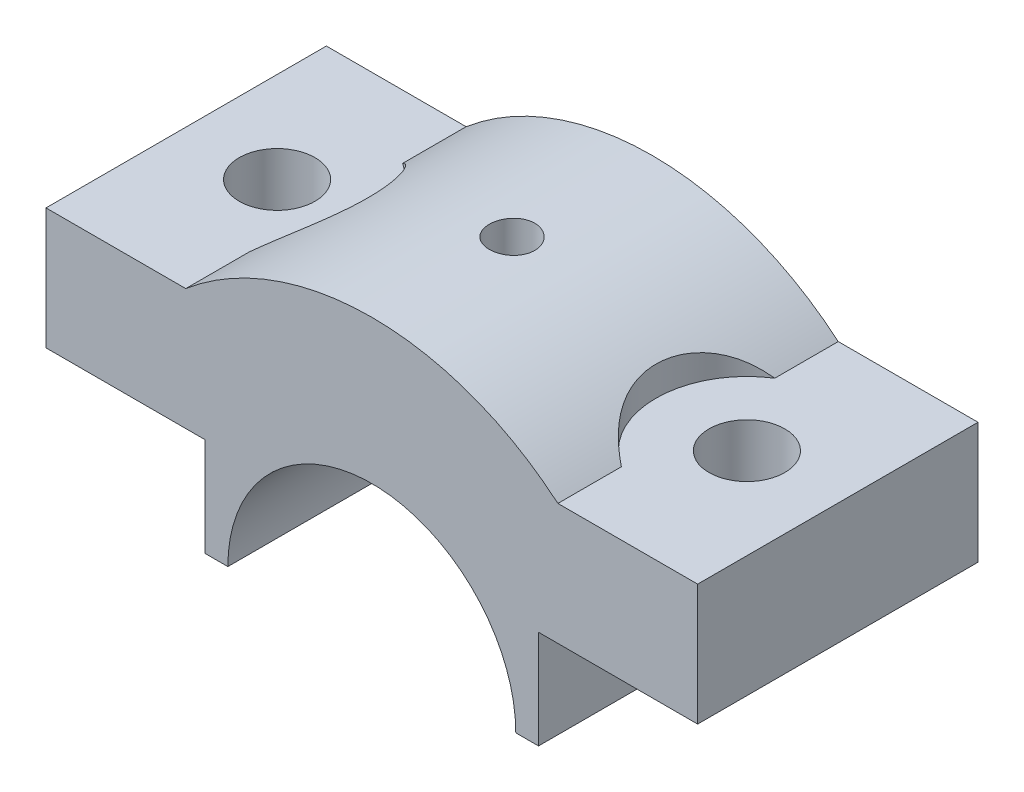
ISO-10303-21;
HEADER;
FILE_DESCRIPTION(('STEP AP214'),'2;1');
FILE_NAME('part.step','',(''),(''),'','','');
FILE_SCHEMA(('AUTOMOTIVE_DESIGN { 1 0 10303 214 1 1 1 1 }'));
ENDSEC;
DATA;
#1=APPLICATION_CONTEXT('core data for automotive mechanical design processes');
#2=APPLICATION_PROTOCOL_DEFINITION('international standard','automotive_design',2000,#1);
#3=PRODUCT_CONTEXT('',#1,'mechanical');
#4=PRODUCT('Part','Part','',(#3));
#5=PRODUCT_RELATED_PRODUCT_CATEGORY('part','',(#4));
#6=PRODUCT_DEFINITION_FORMATION('','',#4);
#7=PRODUCT_DEFINITION_CONTEXT('part definition',#1,'design');
#8=PRODUCT_DEFINITION('design','',#6,#7);
#9=PRODUCT_DEFINITION_SHAPE('','',#8);
#10=(LENGTH_UNIT() NAMED_UNIT(*) SI_UNIT(.MILLI.,.METRE.));
#11=(NAMED_UNIT(*) PLANE_ANGLE_UNIT() SI_UNIT($,.RADIAN.));
#12=(NAMED_UNIT(*) SI_UNIT($,.STERADIAN.) SOLID_ANGLE_UNIT());
#13=UNCERTAINTY_MEASURE_WITH_UNIT(LENGTH_MEASURE(1.E-05),#10,'distance_accuracy_value','');
#14=(GEOMETRIC_REPRESENTATION_CONTEXT(3) GLOBAL_UNCERTAINTY_ASSIGNED_CONTEXT((#13)) GLOBAL_UNIT_ASSIGNED_CONTEXT((#10,
#11,#12)) REPRESENTATION_CONTEXT('',''));
#15=CARTESIAN_POINT('',(0.,0.,0.));
#16=DIRECTION('',(0.,0.,1.));
#17=DIRECTION('',(1.,0.,0.));
#18=AXIS2_PLACEMENT_3D('',#15,#16,#17);
#19=CARTESIAN_POINT('',(0.,0.,37.));
#20=DIRECTION('',(0.,0.,-1.));
#21=DIRECTION('',(-1.,0.,0.));
#22=AXIS2_PLACEMENT_3D('',#19,#20,#21);
#23=CYLINDRICAL_SURFACE('',#22,38.);
#24=CARTESIAN_POINT('',(24.5560583156173,29.,8.37697596721832));
#25=CARTESIAN_POINT('',(24.3174877485478,29.2020601308055,8.52880532678772));
#26=CARTESIAN_POINT('',(24.0803614609093,29.3977464472566,8.69163802336802));
#27=CARTESIAN_POINT('',(23.6115222338329,29.7755940747945,9.03979151666468));
#28=CARTESIAN_POINT('',(23.3798137585638,29.9577444842871,9.22513012953136));
#29=CARTESIAN_POINT('',(22.9236672054079,30.3082297817881,9.61944940490282));
#30=CARTESIAN_POINT('',(22.6992678834907,30.4764965902736,9.82853585241824));
#31=CARTESIAN_POINT('',(22.2619530588752,30.7973853777589,10.2693930241928));
#32=CARTESIAN_POINT('',(22.0490345989108,30.9500113947584,10.5011578631887));
#33=CARTESIAN_POINT('',(21.6366389073685,31.2397139014292,10.9880250162818));
#34=CARTESIAN_POINT('',(21.4372383074072,31.3767043342369,11.2432437261789));
#35=CARTESIAN_POINT('',(21.0562467019345,31.633641893745,11.7747724046578));
#36=CARTESIAN_POINT('',(20.8746574661727,31.7535873273726,12.0510844642489));
#37=CARTESIAN_POINT('',(20.5327564022872,31.9757314891997,12.6223021685555));
#38=CARTESIAN_POINT('',(20.3723929409772,32.0779734764171,12.9171600193247));
#39=CARTESIAN_POINT('',(20.0751813729038,32.2648095853997,13.5238179116656));
#40=CARTESIAN_POINT('',(19.938330146147,32.349406048985,13.8356156981269));
#41=CARTESIAN_POINT('',(19.7031571958431,32.4931162623317,14.4409607265898));
#42=CARTESIAN_POINT('',(19.6023304372824,32.5539481974974,14.7331305874555));
#43=CARTESIAN_POINT('',(19.4229982355688,32.661262620038,15.3268061987076));
#44=CARTESIAN_POINT('',(19.3444914281107,32.707745984483,15.6283113772236));
#45=CARTESIAN_POINT('',(19.2108996671468,32.7863897663112,16.2384329952647));
#46=CARTESIAN_POINT('',(19.1558244632389,32.8185442218776,16.5470523387123));
#47=CARTESIAN_POINT('',(19.0699386598041,32.8685247770595,17.1687946625474));
#48=CARTESIAN_POINT('',(19.0391272676089,32.8863513447496,17.4819174954713));
#49=CARTESIAN_POINT('',(19.0033366089455,32.9070445700549,18.0909071788436));
#50=CARTESIAN_POINT('',(18.9968952852205,32.9107579979133,18.3866606151427));
#51=CARTESIAN_POINT('',(19.0058709098437,32.9055755487408,18.9777151692396));
#52=CARTESIAN_POINT('',(19.0212867536059,32.8966803089086,19.2730163091401));
#53=CARTESIAN_POINT('',(19.0737722856435,32.8662764129345,19.8609465930672));
#54=CARTESIAN_POINT('',(19.1108359102242,32.8447712889028,20.1535764620329));
#55=CARTESIAN_POINT('',(19.2061408416427,32.7891322412201,20.7341490720516));
#56=CARTESIAN_POINT('',(19.264382276703,32.7549982411068,21.0220917847148));
#57=CARTESIAN_POINT('',(19.4006764422116,32.6744541101646,21.5886588319729));
#58=CARTESIAN_POINT('',(19.4785435602166,32.6281588318639,21.8673442180909));
#59=CARTESIAN_POINT('',(19.6533719646105,32.5231511116921,22.4162477828628));
#60=CARTESIAN_POINT('',(19.7503330082788,32.4644388276644,22.6864660690993));
#61=CARTESIAN_POINT('',(19.9621218133717,32.3346424316118,23.2166418111918));
#62=CARTESIAN_POINT('',(20.0769448179247,32.2635616128921,23.4766019758774));
#63=CARTESIAN_POINT('',(20.323071538153,32.1090931283231,23.9847892596351));
#64=CARTESIAN_POINT('',(20.4543754358737,32.0257053265307,24.2330162490626));
#65=CARTESIAN_POINT('',(20.7357486540301,31.8442696037435,24.723117088294));
#66=CARTESIAN_POINT('',(20.8862381186548,31.7458786272729,24.9646225824166));
#67=CARTESIAN_POINT('',(21.201110037337,31.5364658710071,25.4326270062543));
#68=CARTESIAN_POINT('',(21.3654931809921,31.4254434641697,25.6591251901014));
#69=CARTESIAN_POINT('',(21.7063737161355,31.1909623888811,26.0964085949474));
#70=CARTESIAN_POINT('',(21.8828828178434,31.0674916435289,26.3071782050159));
#71=CARTESIAN_POINT('',(22.2458177672454,30.8086571106979,26.7120807419208));
#72=CARTESIAN_POINT('',(22.4322425263686,30.6732946276711,26.906215488898));
#73=CARTESIAN_POINT('',(22.9298954071164,30.3045469407131,27.3914120034024));
#74=CARTESIAN_POINT('',(23.2476114084472,30.0619152228811,27.6689892609468));
#75=CARTESIAN_POINT('',(23.7330937930094,29.6779862071021,28.0516756753478));
#76=CARTESIAN_POINT('',(23.896151828646,29.5468936289064,28.1734651547196));
#77=CARTESIAN_POINT('',(24.2245693700738,29.2782386813056,28.4062595620869));
#78=CARTESIAN_POINT('',(24.3899285039598,29.140677349028,28.5172662101907));
#79=CARTESIAN_POINT('',(24.5560583156173,29.,28.6230240327817));
#80=B_SPLINE_CURVE_WITH_KNOTS('',3,(#24,#25,#26,#27,#28,#29,#30,#31,#32,#33,#34,#35,#36,#37,#38,
#39,#40,#41,#42,#43,#44,#45,#46,#47,#48,#49,#50,#51,#52,#53,#54,#55,#56,#57,#58,#59,#60,#61,#62,
#63,#64,#65,#66,#67,#68,#69,#70,#71,#72,#73,#74,#75,#76,#77,#78,#79),.UNSPECIFIED.,.F.,.F.,(4,2,
2,2,2,2,2,2,2,2,2,2,2,2,2,2,2,2,2,2,2,2,2,2,2,2,2,4),(0.,1.04260461579408,2.08604002646036,
3.13432060286791,4.18232985812433,5.23585430274668,6.28948332048406,7.34050026578761,
8.3913776368236,9.33518162511065,10.2789279110469,11.2230664949041,12.1671742336547,
13.0536509025234,13.9400827735082,14.8262664677282,15.7124555274994,16.590558754706,
17.4686508202461,18.346509437567,19.2243777524392,20.1266463918459,21.028959840704,
21.9321572606495,22.8352557287013,24.2916394519587,25.0176312708732,25.7435070866397),.UNSPECIFIED.);
#81=CARTESIAN_POINT('',(24.5560583156174,29.,8.37697596721831));
#82=VERTEX_POINT('',#81);
#83=CARTESIAN_POINT('',(24.5560583156174,29.,28.6230240327817));
#84=VERTEX_POINT('',#83);
#85=EDGE_CURVE('E144',#82,#84,#80,.T.);
#86=ORIENTED_EDGE('',*,*,#85,.F.);
#87=DIRECTION('',(0.,0.,-1.));
#88=VECTOR('',#87,1.);
#89=CARTESIAN_POINT('',(24.5560583156174,29.,37.));
#90=LINE('',#89,#88);
#91=CARTESIAN_POINT('',(24.5560583156174,29.,0.));
#92=VERTEX_POINT('',#91);
#93=EDGE_CURVE('E151',#82,#92,#90,.T.);
#94=ORIENTED_EDGE('',*,*,#93,.T.);
#95=CARTESIAN_POINT('',(0.,0.,0.));
#96=DIRECTION('',(0.,0.,1.));
#97=DIRECTION('',(1.,0.,0.));
#98=AXIS2_PLACEMENT_3D('',#95,#96,#97);
#99=CIRCLE('',#98,38.);
#100=CARTESIAN_POINT('',(-24.5560583156174,29.,0.));
#101=VERTEX_POINT('',#100);
#102=EDGE_CURVE('E268',#92,#101,#99,.T.);
#103=ORIENTED_EDGE('',*,*,#102,.T.);
#104=DIRECTION('',(0.,0.,-1.));
#105=VECTOR('',#104,1.);
#106=CARTESIAN_POINT('',(-24.5560583156174,29.,37.));
#107=LINE('',#106,#105);
#108=CARTESIAN_POINT('',(-24.5560583156174,29.,8.3769759672183));
#109=VERTEX_POINT('',#108);
#110=EDGE_CURVE('E164',#109,#101,#107,.T.);
#111=ORIENTED_EDGE('',*,*,#110,.F.);
#112=CARTESIAN_POINT('',(-24.5560583156173,29.,28.6230240327817));
#113=CARTESIAN_POINT('',(-24.3174877485478,29.2020601308055,28.4711946732123));
#114=CARTESIAN_POINT('',(-24.0803614609093,29.3977464472566,28.308361976632));
#115=CARTESIAN_POINT('',(-23.6115222338329,29.7755940747945,27.9602084833353));
#116=CARTESIAN_POINT('',(-23.3798137585639,29.9577444842871,27.7748698704687));
#117=CARTESIAN_POINT('',(-22.9236672054079,30.3082297817881,27.3805505950972));
#118=CARTESIAN_POINT('',(-22.6992678834907,30.4764965902736,27.1714641475818));
#119=CARTESIAN_POINT('',(-22.2619530588752,30.7973853777589,26.7306069758073));
#120=CARTESIAN_POINT('',(-22.0490345989108,30.9500113947584,26.4988421368114));
#121=CARTESIAN_POINT('',(-21.6366389073685,31.2397139014292,26.0119749837182));
#122=CARTESIAN_POINT('',(-21.4372383074072,31.3767043342369,25.7567562738212));
#123=CARTESIAN_POINT('',(-21.0562467019345,31.633641893745,25.2252275953423));
#124=CARTESIAN_POINT('',(-20.8746574661727,31.7535873273726,24.9489155357511));
#125=CARTESIAN_POINT('',(-20.5327564022873,31.9757314891997,24.3776978314445));
#126=CARTESIAN_POINT('',(-20.3723929409772,32.0779734764171,24.0828399806753));
#127=CARTESIAN_POINT('',(-20.0751813729038,32.2648095853997,23.4761820883344));
#128=CARTESIAN_POINT('',(-19.938330146147,32.349406048985,23.1643843018731));
#129=CARTESIAN_POINT('',(-19.7031571958431,32.4931162623317,22.5590392734102));
#130=CARTESIAN_POINT('',(-19.6023304372824,32.5539481974974,22.2668694125445));
#131=CARTESIAN_POINT('',(-19.4229982355688,32.661262620038,21.6731938012924));
#132=CARTESIAN_POINT('',(-19.3444914281107,32.707745984483,21.3716886227764));
#133=CARTESIAN_POINT('',(-19.2108996671468,32.7863897663113,20.7615670047353));
#134=CARTESIAN_POINT('',(-19.1558244632389,32.8185442218776,20.4529476612877));
#135=CARTESIAN_POINT('',(-19.0699386598041,32.8685247770595,19.8312053374526));
#136=CARTESIAN_POINT('',(-19.0391272676089,32.8863513447496,19.5180825045287));
#137=CARTESIAN_POINT('',(-19.0033366089455,32.9070445700549,18.9090928211564));
#138=CARTESIAN_POINT('',(-18.9968952852205,32.9107579979134,18.6133393848573));
#139=CARTESIAN_POINT('',(-19.0058709098437,32.9055755487409,18.0222848307604));
#140=CARTESIAN_POINT('',(-19.0212867536059,32.8966803089086,17.7269836908599));
#141=CARTESIAN_POINT('',(-19.0737722856435,32.8662764129345,17.1390534069328));
#142=CARTESIAN_POINT('',(-19.1108359102242,32.8447712889028,16.8464235379671));
#143=CARTESIAN_POINT('',(-19.2061408416427,32.7891322412201,16.2658509279485));
#144=CARTESIAN_POINT('',(-19.264382276703,32.7549982411068,15.9779082152852));
#145=CARTESIAN_POINT('',(-19.4006764422116,32.6744541101646,15.4113411680271));
#146=CARTESIAN_POINT('',(-19.4785435602166,32.6281588318639,15.1326557819091));
#147=CARTESIAN_POINT('',(-19.6533719646105,32.5231511116921,14.5837522171372));
#148=CARTESIAN_POINT('',(-19.7503330082788,32.4644388276644,14.3135339309007));
#149=CARTESIAN_POINT('',(-19.9621218133717,32.3346424316118,13.7833581888082));
#150=CARTESIAN_POINT('',(-20.0769448179247,32.2635616128921,13.5233980241226));
#151=CARTESIAN_POINT('',(-20.323071538153,32.1090931283231,13.0152107403649));
#152=CARTESIAN_POINT('',(-20.4543754358737,32.0257053265308,12.7669837509374));
#153=CARTESIAN_POINT('',(-20.7357486540301,31.8442696037435,12.2768829117061));
#154=CARTESIAN_POINT('',(-20.8862381186548,31.7458786272729,12.0353774175834));
#155=CARTESIAN_POINT('',(-21.201110037337,31.5364658710071,11.5673729937457));
#156=CARTESIAN_POINT('',(-21.3654931809921,31.4254434641697,11.3408748098987));
#157=CARTESIAN_POINT('',(-21.7063737161354,31.1909623888811,10.9035914050526));
#158=CARTESIAN_POINT('',(-21.8828828178434,31.0674916435289,10.6928217949841));
#159=CARTESIAN_POINT('',(-22.2458177672454,30.8086571106979,10.2879192580792));
#160=CARTESIAN_POINT('',(-22.4322425263686,30.6732946276711,10.093784511102));
#161=CARTESIAN_POINT('',(-22.9298954071164,30.3045469407131,9.60858799659761));
#162=CARTESIAN_POINT('',(-23.2476114084472,30.0619152228811,9.33101073905317));
#163=CARTESIAN_POINT('',(-23.7330937930094,29.6779862071021,8.94832432465222));
#164=CARTESIAN_POINT('',(-23.896151828646,29.5468936289064,8.82653484528045));
#165=CARTESIAN_POINT('',(-24.2245693700738,29.2782386813056,8.59374043791307));
#166=CARTESIAN_POINT('',(-24.3899285039598,29.140677349028,8.48273378980929));
#167=CARTESIAN_POINT('',(-24.5560583156173,29.,8.37697596721831));
#168=B_SPLINE_CURVE_WITH_KNOTS('',3,(#112,#113,#114,#115,#116,#117,#118,#119,#120,#121,#122,
#123,#124,#125,#126,#127,#128,#129,#130,#131,#132,#133,#134,#135,#136,#137,#138,#139,#140,#141,
#142,#143,#144,#145,#146,#147,#148,#149,#150,#151,#152,#153,#154,#155,#156,#157,#158,#159,#160,
#161,#162,#163,#164,#165,#166,#167),.UNSPECIFIED.,.F.,.F.,(4,2,2,2,2,2,2,2,2,2,2,2,2,2,2,2,2,2,
2,2,2,2,2,2,2,2,2,4),(0.,1.04260461579408,2.08604002646036,3.13432060286791,4.18232985812432,
5.23585430274667,6.28948332048406,7.34050026578761,8.3913776368236,9.33518162511065,
10.2789279110469,11.2230664949041,12.1671742336547,13.0536509025234,13.9400827735082,
14.8262664677282,15.7124555274994,16.590558754706,17.4686508202461,18.346509437567,
19.2243777524392,20.1266463918459,21.028959840704,21.9321572606495,22.8352557287013,
24.2916394519587,25.0176312708732,25.7435070866397),.UNSPECIFIED.);
#169=CARTESIAN_POINT('',(-24.5560583156174,29.,28.6230240327817));
#170=VERTEX_POINT('',#169);
#171=EDGE_CURVE('E216',#170,#109,#168,.T.);
#172=ORIENTED_EDGE('',*,*,#171,.F.);
#173=CARTESIAN_POINT('',(-24.5560583156174,29.,37.));
#174=VERTEX_POINT('',#173);
#175=EDGE_CURVE('E161',#174,#170,#107,.T.);
#176=ORIENTED_EDGE('',*,*,#175,.F.);
#177=CARTESIAN_POINT('',(0.,0.,37.));
#178=DIRECTION('',(0.,0.,1.));
#179=DIRECTION('',(1.,0.,0.));
#180=AXIS2_PLACEMENT_3D('',#177,#178,#179);
#181=CIRCLE('',#180,38.);
#182=CARTESIAN_POINT('',(24.5560583156174,29.,37.));
#183=VERTEX_POINT('',#182);
#184=EDGE_CURVE('E243',#183,#174,#181,.T.);
#185=ORIENTED_EDGE('',*,*,#184,.F.);
#186=EDGE_CURVE('E154',#183,#84,#90,.T.);
#187=ORIENTED_EDGE('',*,*,#186,.T.);
#188=EDGE_LOOP('',(#86,#94,#103,#111,#172,#176,#185,#187));
#189=FACE_BOUND('',#188,.T.);
#190=CARTESIAN_POINT('',(0.,38.,15.5));
#191=CARTESIAN_POINT('',(-0.168230277437708,37.9999984430739,15.5000073613165));
#192=CARTESIAN_POINT('',(-0.336575845655097,37.9988709200709,15.5141983008307));
#193=CARTESIAN_POINT('',(-0.668611397196744,37.9944814128081,15.5706010506967));
#194=CARTESIAN_POINT('',(-0.832295850092011,37.9912169949171,15.6128448101706));
#195=CARTESIAN_POINT('',(-1.15015205512758,37.9829226863334,15.7241259364293));
#196=CARTESIAN_POINT('',(-1.30432904935511,37.9778937789401,15.7931483824778));
#197=CARTESIAN_POINT('',(-1.59887136159142,37.9666348413683,15.9560014603645));
#198=CARTESIAN_POINT('',(-1.73923967362019,37.9604050724332,16.0498266980835));
#199=CARTESIAN_POINT('',(-2.00254103126273,37.9474277075509,16.2598559067268));
#200=CARTESIAN_POINT('',(-2.12543792166293,37.9406790810774,16.3761051436065));
#201=CARTESIAN_POINT('',(-2.3499978098834,37.9274332919605,16.6275871839404));
#202=CARTESIAN_POINT('',(-2.45165988585508,37.9209361402441,16.7628208111216));
#203=CARTESIAN_POINT('',(-2.63098484586303,37.9089176287414,17.0486493431715));
#204=CARTESIAN_POINT('',(-2.708616254697,37.903397552738,17.1992640537629));
#205=CARTESIAN_POINT('',(-2.83747510230932,37.8939696224707,17.5114411509401));
#206=CARTESIAN_POINT('',(-2.8887029645124,37.8900617423529,17.6730033619177));
#207=CARTESIAN_POINT('',(-2.96319644645853,37.8843090780475,18.0021293201804));
#208=CARTESIAN_POINT('',(-2.98652059882487,37.8824599758018,18.1696797426422));
#209=CARTESIAN_POINT('',(-3.00472536931326,37.8810204867557,18.50632681715));
#210=CARTESIAN_POINT('',(-2.99960647157769,37.8814300615093,18.6754234428283));
#211=CARTESIAN_POINT('',(-2.96111886260012,37.8844577346025,19.0099623100353));
#212=CARTESIAN_POINT('',(-2.92781369865024,37.8870708648728,19.1754119137107));
#213=CARTESIAN_POINT('',(-2.83399765916123,37.8942034046858,19.4983652151233));
#214=CARTESIAN_POINT('',(-2.7734865418375,37.8987228311701,19.6558688422291));
#215=CARTESIAN_POINT('',(-2.62690490032728,37.9091644380148,19.9586621497191));
#216=CARTESIAN_POINT('',(-2.5408057912968,37.9150881856643,20.1039379359988));
#217=CARTESIAN_POINT('',(-2.34551283184453,37.9276694800349,20.3779997879104));
#218=CARTESIAN_POINT('',(-2.23631856235737,37.9343270400699,20.5067855542603));
#219=CARTESIAN_POINT('',(-1.99757813910437,37.947647885739,20.7445811589606));
#220=CARTESIAN_POINT('',(-1.86797703439474,37.9543111370687,20.8535358375863));
#221=CARTESIAN_POINT('',(-1.59229376436977,37.9668751419437,21.0481501987912));
#222=CARTESIAN_POINT('',(-1.44621158946689,37.9727758950454,21.1338098678187));
#223=CARTESIAN_POINT('',(-1.14167761997914,37.9831509930839,21.2793989254703));
#224=CARTESIAN_POINT('',(-0.983224692335493,37.9876252071703,21.3393259539218));
#225=CARTESIAN_POINT('',(-0.658463212690181,37.9946415451888,21.431710419429));
#226=CARTESIAN_POINT('',(-0.492154807064351,37.997183705107,21.4641683681196));
#227=CARTESIAN_POINT('',(-0.156881478742689,38.0000448768352,21.5006243444068));
#228=CARTESIAN_POINT('',(0.0120751089608337,38.0003698415183,21.5046985791048));
#229=CARTESIAN_POINT('',(0.348269003373995,37.9987758913175,21.484470989434));
#230=CARTESIAN_POINT('',(0.51550632444248,37.9968569951891,21.4601694022469));
#231=CARTESIAN_POINT('',(0.84329775373575,37.9909950041868,21.3839431497959));
#232=CARTESIAN_POINT('',(1.00386010671882,37.987054491835,21.3320537236703));
#233=CARTESIAN_POINT('',(1.31399900365978,37.9775920824189,21.2021606871078));
#234=CARTESIAN_POINT('',(1.46357539119334,37.972070162843,21.1241567049251));
#235=CARTESIAN_POINT('',(1.7478437504178,37.9600494395666,20.9440567104013));
#236=CARTESIAN_POINT('',(1.88250358772923,37.953548595394,20.8419101156975));
#237=CARTESIAN_POINT('',(2.13279217984117,37.9403075453845,20.6164976605111));
#238=CARTESIAN_POINT('',(2.24842063776818,37.9335673358158,20.4932314706419));
#239=CARTESIAN_POINT('',(2.4576248497514,37.9205896766453,20.2287486483517));
#240=CARTESIAN_POINT('',(2.55115094155127,37.9143533795852,20.0874926690468));
#241=CARTESIAN_POINT('',(2.713155238272,37.9031055627809,19.7912362944175));
#242=CARTESIAN_POINT('',(2.78163367119924,37.8980940318878,19.6362360242219));
#243=CARTESIAN_POINT('',(2.89151387110069,37.8898693720601,19.3170680997872));
#244=CARTESIAN_POINT('',(2.93294623887224,37.8866542112497,19.152911034999));
#245=CARTESIAN_POINT('',(2.98765790023766,37.8823793491511,18.8199438503732));
#246=CARTESIAN_POINT('',(3.00093767292138,37.8813196111828,18.6511338097677));
#247=CARTESIAN_POINT('',(2.99896188688675,37.8814760426207,18.3141461410571));
#248=CARTESIAN_POINT('',(2.98378436644712,37.8826859878913,18.1459680469984));
#249=CARTESIAN_POINT('',(2.92548733876923,37.887232237977,17.8145571269809));
#250=CARTESIAN_POINT('',(2.8823677867555,37.8905685461995,17.651324308947));
#251=CARTESIAN_POINT('',(2.76943001015431,37.8989899804525,17.3344310031299));
#252=CARTESIAN_POINT('',(2.69961296444522,37.9040750292632,17.1807700930293));
#253=CARTESIAN_POINT('',(2.535271096382,37.9154210711218,16.8873382190511));
#254=CARTESIAN_POINT('',(2.44074672054795,37.9216820429175,16.7475670042168));
#255=CARTESIAN_POINT('',(2.22938062382269,37.9346948182221,16.485483197116));
#256=CARTESIAN_POINT('',(2.11248130954252,37.941447859921,16.3632171148457));
#257=CARTESIAN_POINT('',(1.85978424897896,37.954672635902,16.1399944386958));
#258=CARTESIAN_POINT('',(1.72398192526552,37.9611443015481,16.0390430211844));
#259=CARTESIAN_POINT('',(1.43709756450134,37.9730876131211,15.8611945743245));
#260=CARTESIAN_POINT('',(1.28598975831931,37.978557527474,15.7843390356271));
#261=CARTESIAN_POINT('',(0.973076064569832,37.9878601967286,15.6571879981005));
#262=CARTESIAN_POINT('',(0.811282773093932,37.9916948408735,15.6068618336675));
#263=CARTESIAN_POINT('',(0.540438770546247,37.9963056825779,15.5470770342797));
#264=CARTESIAN_POINT('',(0.433132098217291,37.9976847801055,15.5294464608297));
#265=CARTESIAN_POINT('',(0.217232975456251,37.9995324404705,15.5059055804936));
#266=CARTESIAN_POINT('',(0.108640528034262,38.0000010054389,15.4999952461749));
#267=CARTESIAN_POINT('',(0.,38.,15.5));
#268=B_SPLINE_CURVE_WITH_KNOTS('',3,(#190,#191,#192,#193,#194,#195,#196,#197,#198,#199,#200,
#201,#202,#203,#204,#205,#206,#207,#208,#209,#210,#211,#212,#213,#214,#215,#216,#217,#218,#219,
#220,#221,#222,#223,#224,#225,#226,#227,#228,#229,#230,#231,#232,#233,#234,#235,#236,#237,#238,
#239,#240,#241,#242,#243,#244,#245,#246,#247,#248,#249,#250,#251,#252,#253,#254,#255,#256,#257,
#258,#259,#260,#261,#262,#263,#264,#265,#266,#267),.UNSPECIFIED.,.T.,.F.,(4,2,2,2,2,2,2,2,2,2,2,
2,2,2,2,2,2,2,2,2,2,2,2,2,2,2,2,2,2,2,2,2,2,2,2,2,2,2,4),(0.,0.504294188546741,1.00916370078726,
1.51375230936014,2.01823126998903,2.5237394549149,3.0292695804704,3.53545907123703,
4.04164044416132,4.54675814609821,5.05186725021796,5.55584058602809,6.05981840083594,
6.56436134901273,7.06891345298729,7.57484819748389,8.0807832362998,8.5867646690735,
9.09273667730812,9.59734968185782,10.1019584685879,10.6059242398503,11.1098971854695,
11.614935538604,12.1199817691652,12.6261522324058,13.1323180879118,13.6379102536977,
14.1434938154447,14.6476929456065,15.1518928837201,15.6560705605014,16.1602391262259,
16.6657233184336,17.1713301290485,17.6778028214878,18.183688785524,18.5093549854357,
18.8350204230892),.UNSPECIFIED.);
#269=CARTESIAN_POINT('',(0.,38.,15.5));
#270=VERTEX_POINT('',#269);
#271=EDGE_CURVE('E40',#270,#270,#268,.T.);
#272=ORIENTED_EDGE('',*,*,#271,.F.);
#273=EDGE_LOOP('',(#272));
#274=FACE_BOUND('',#273,.T.);
#275=ADVANCED_FACE('F35',(#189,#274),#23,.T.);
#276=CARTESIAN_POINT('',(0.,50.,18.5));
#277=DIRECTION('',(0.,-1.,0.));
#278=DIRECTION('',(0.,0.,-1.));
#279=AXIS2_PLACEMENT_3D('',#276,#277,#278);
#280=CYLINDRICAL_SURFACE('',#279,2.);
#281=CARTESIAN_POINT('',(0.,19.,16.5));
#282=CARTESIAN_POINT('',(0.11200841784424,18.9999986504858,16.5000048342617));
#283=CARTESIAN_POINT('',(0.224090111161561,18.9989990230296,16.5094411031933));
#284=CARTESIAN_POINT('',(0.445143942835667,18.9951074391116,16.546940529852));
#285=CARTESIAN_POINT('',(0.554112554348489,18.9922134187954,16.5750240033354));
#286=CARTESIAN_POINT('',(0.765707302443462,18.9848596062168,16.6489892969702));
#287=CARTESIAN_POINT('',(0.868337309177082,18.9804007807146,16.6948601296548));
#288=CARTESIAN_POINT('',(1.06441973305317,18.9704154188168,16.803076162302));
#289=CARTESIAN_POINT('',(1.15787392189217,18.9648890891521,16.8654181733423));
#290=CARTESIAN_POINT('',(1.33334438873615,18.9533628684286,17.005072044034));
#291=CARTESIAN_POINT('',(1.41531912695826,18.9473613745813,17.082435969734));
#292=CARTESIAN_POINT('',(1.565146544656,18.9355744197151,17.2498263406891));
#293=CARTESIAN_POINT('',(1.63299855874326,18.9297889688855,17.3398533822287));
#294=CARTESIAN_POINT('',(1.75280323659791,18.9190729200505,17.5302766054227));
#295=CARTESIAN_POINT('',(1.80471802529949,18.914144370344,17.6306967413155));
#296=CARTESIAN_POINT('',(1.89093273887728,18.9057203232874,17.838889775574));
#297=CARTESIAN_POINT('',(1.92523314323209,18.9022247869301,17.946662473706));
#298=CARTESIAN_POINT('',(1.97512160268772,18.8970772279925,18.166075990837));
#299=CARTESIAN_POINT('',(1.99077883849768,18.89541839144,18.2777009175288));
#300=CARTESIAN_POINT('',(2.0031504028124,18.8941109684303,18.5020056067456));
#301=CARTESIAN_POINT('',(1.99986527971529,18.8944623237764,18.6146853386389));
#302=CARTESIAN_POINT('',(1.97450235287994,18.8971293595455,18.837423187697));
#303=CARTESIAN_POINT('',(1.9525002124111,18.8994371310552,18.9474900286008));
#304=CARTESIAN_POINT('',(1.89044560340129,18.9057446232425,19.1623601670323));
#305=CARTESIAN_POINT('',(1.85039286737173,18.9097443689933,19.2671633865337));
#306=CARTESIAN_POINT('',(1.75329092276144,18.9189942182592,19.4687695588402));
#307=CARTESIAN_POINT('',(1.69620827788725,18.924246777425,19.5655562900819));
#308=CARTESIAN_POINT('',(1.5666908868141,18.9354083854364,19.7482045102272));
#309=CARTESIAN_POINT('',(1.49425564251871,18.9413174555787,19.8340656445184));
#310=CARTESIAN_POINT('',(1.33566725362225,18.9531615143885,19.9928649694557));
#311=CARTESIAN_POINT('',(1.24944878844049,18.9590964885675,20.0657379432733));
#312=CARTESIAN_POINT('',(1.06596783254353,18.9702964129385,20.1959864275575));
#313=CARTESIAN_POINT('',(0.968705327324303,18.9755613622506,20.253361917671));
#314=CARTESIAN_POINT('',(0.765851049247981,18.9848300236665,20.3509846495696));
#315=CARTESIAN_POINT('',(0.660257600030995,18.9888334811183,20.391228433625));
#316=CARTESIAN_POINT('',(0.443760807693444,18.9951255457873,20.4533968219064));
#317=CARTESIAN_POINT('',(0.332857640703189,18.9974142098446,20.4753220333392));
#318=CARTESIAN_POINT('',(0.109454154862349,19.0000115000819,20.5001478206134));
#319=CARTESIAN_POINT('',(-0.00303606230926741,19.0003294893725,20.5031383607282));
#320=CARTESIAN_POINT('',(-0.226916078948063,18.9989747412679,20.4902464207248));
#321=CARTESIAN_POINT('',(-0.33830589489262,18.9973020337271,20.4743642236396));
#322=CARTESIAN_POINT('',(-0.556562384347411,18.9921598049335,20.4242523035523));
#323=CARTESIAN_POINT('',(-0.663438869422736,18.9886944241164,20.3900648528064));
#324=CARTESIAN_POINT('',(-0.869940226842278,18.9803554527278,20.3043564208408));
#325=CARTESIAN_POINT('',(-0.969564920006209,18.9754818273755,20.2528350115032));
#326=CARTESIAN_POINT('',(-1.1591405212946,18.9648478148886,20.1336991040721));
#327=CARTESIAN_POINT('',(-1.2490542105761,18.9590842083916,20.0660256733537));
#328=CARTESIAN_POINT('',(-1.4162783677793,18.9473268886042,19.9165910044636));
#329=CARTESIAN_POINT('',(-1.49358848438461,18.9413331689054,19.834829373723));
#330=CARTESIAN_POINT('',(-1.63372463331255,18.9297628392476,19.6591459388554));
#331=CARTESIAN_POINT('',(-1.69649150588153,18.9241879932099,19.5651768125407));
#332=CARTESIAN_POINT('',(-1.80535237129506,18.9141138909103,19.3679784993518));
#333=CARTESIAN_POINT('',(-1.85144661326567,18.9096146185771,19.2647494508703));
#334=CARTESIAN_POINT('',(-1.92555535445661,18.9022123156369,19.0521621576929));
#335=CARTESIAN_POINT('',(-1.95360469740686,18.8993062103248,18.9428161711808));
#336=CARTESIAN_POINT('',(-1.99094032598198,18.8954098830964,18.7209342024658));
#337=CARTESIAN_POINT('',(-2.0002272132674,18.8944195997449,18.6083983226713));
#338=CARTESIAN_POINT('',(-1.99976544627054,18.8944684327453,18.3839191394378));
#339=CARTESIAN_POINT('',(-1.99010972282517,18.8954976416447,18.2719756311244));
#340=CARTESIAN_POINT('',(-1.95223204844791,18.8994483350085,18.0513107230277));
#341=CARTESIAN_POINT('',(-1.92401007974408,18.9023698212842,17.9425893263288));
#342=CARTESIAN_POINT('',(-1.8498273564277,18.9097730829315,17.73145780667));
#343=CARTESIAN_POINT('',(-1.80386967534044,18.914254587945,17.6290465937453));
#344=CARTESIAN_POINT('',(-1.69552954133722,18.92427346405,17.4333762794503));
#345=CARTESIAN_POINT('',(-1.63314712244591,18.9298108329541,17.3401171591214));
#346=CARTESIAN_POINT('',(-1.49337993384352,18.9413500753827,17.1649221503882));
#347=CARTESIAN_POINT('',(-1.41592586926296,18.9473540143885,17.0830416782544));
#348=CARTESIAN_POINT('',(-1.24835332858252,18.9591311345796,16.9334006541569));
#349=CARTESIAN_POINT('',(-1.15823183336865,18.9649042603311,16.8656434778802));
#350=CARTESIAN_POINT('',(-0.967607481740734,18.975586079652,16.7460225173412));
#351=CARTESIAN_POINT('',(-0.867076685429857,18.9804923457825,16.6942030719494));
#352=CARTESIAN_POINT('',(-0.658751573856579,18.9888617207062,16.6082506917677));
#353=CARTESIAN_POINT('',(-0.550965545177141,18.9923264445262,16.5740979536469));
#354=CARTESIAN_POINT('',(-0.368815809489714,18.9965585235102,16.5328994821718));
#355=CARTESIAN_POINT('',(-0.295613709369329,18.9978430079455,16.5205791986967));
#356=CARTESIAN_POINT('',(-0.148285110063316,18.9995641909453,16.5041278764855));
#357=CARTESIAN_POINT('',(-0.0741586152162602,19.0000008934873,16.4999967993285));
#358=CARTESIAN_POINT('',(0.,19.,16.5));
#359=B_SPLINE_CURVE_WITH_KNOTS('',3,(#281,#282,#283,#284,#285,#286,#287,#288,#289,#290,#291,
#292,#293,#294,#295,#296,#297,#298,#299,#300,#301,#302,#303,#304,#305,#306,#307,#308,#309,#310,
#311,#312,#313,#314,#315,#316,#317,#318,#319,#320,#321,#322,#323,#324,#325,#326,#327,#328,#329,
#330,#331,#332,#333,#334,#335,#336,#337,#338,#339,#340,#341,#342,#343,#344,#345,#346,#347,#348,
#349,#350,#351,#352,#353,#354,#355,#356,#357,#358),.UNSPECIFIED.,.T.,.F.,(4,2,2,2,2,2,2,2,2,2,2,
2,2,2,2,2,2,2,2,2,2,2,2,2,2,2,2,2,2,2,2,2,2,2,2,2,2,2,4),(0.,0.335754439352712,
0.671875277970158,1.00778882057924,1.34363737584089,1.68067146079848,2.01772142143432,
2.35556629403224,2.69340196971664,3.02998006509479,3.36654841628655,3.7017626251813,
4.03698180171969,4.3728635237022,4.70875614462734,5.04629056082261,5.38382542030327,
5.72142837292331,6.05902013455861,6.39500668575047,6.73098819823997,7.06619715516562,
7.4014143917639,7.73787392755746,8.07434284033892,8.41215732699427,8.74996676574404,
9.08712193908636,9.42426630061443,9.75976079635823,10.0952556132439,10.4306923163605,
10.7661283246087,11.103144648226,11.4402414318415,11.7782677107181,12.1159142565989,
12.3382118443412,12.5605083891396),.UNSPECIFIED.);
#360=CARTESIAN_POINT('',(0.,19.,16.5));
#361=VERTEX_POINT('',#360);
#362=EDGE_CURVE('E146',#361,#361,#359,.T.);
#363=ORIENTED_EDGE('',*,*,#362,.T.);
#364=EDGE_LOOP('',(#363));
#365=FACE_BOUND('',#364,.T.);
#366=CARTESIAN_POINT('',(0.,25.,18.5));
#367=DIRECTION('',(0.,1.,0.));
#368=DIRECTION('',(0.,0.,1.));
#369=AXIS2_PLACEMENT_3D('',#366,#367,#368);
#370=CIRCLE('',#369,2.);
#371=CARTESIAN_POINT('',(0.,25.,20.5));
#372=VERTEX_POINT('',#371);
#373=EDGE_CURVE('E186',#372,#372,#370,.T.);
#374=ORIENTED_EDGE('',*,*,#373,.T.);
#375=EDGE_LOOP('',(#374));
#376=FACE_BOUND('',#375,.T.);
#377=ADVANCED_FACE('F187',(#365,#376),#280,.F.);
#378=CARTESIAN_POINT('',(0.,0.,37.));
#379=DIRECTION('',(0.,0.,-1.));
#380=DIRECTION('',(-1.,0.,0.));
#381=AXIS2_PLACEMENT_3D('',#378,#379,#380);
#382=CYLINDRICAL_SURFACE('',#381,19.);
#383=CARTESIAN_POINT('',(0.,0.,0.));
#384=DIRECTION('',(0.,0.,-1.));
#385=DIRECTION('',(1.,0.,0.));
#386=AXIS2_PLACEMENT_3D('',#383,#384,#385);
#387=CIRCLE('',#386,19.);
#388=CARTESIAN_POINT('',(-19.,0.,0.));
#389=VERTEX_POINT('',#388);
#390=CARTESIAN_POINT('',(19.,0.,0.));
#391=VERTEX_POINT('',#390);
#392=EDGE_CURVE('E228',#389,#391,#387,.T.);
#393=ORIENTED_EDGE('',*,*,#392,.T.);
#394=DIRECTION('',(0.,0.,-1.));
#395=VECTOR('',#394,1.);
#396=CARTESIAN_POINT('',(19.,0.,37.));
#397=LINE('',#396,#395);
#398=CARTESIAN_POINT('',(19.,0.,37.));
#399=VERTEX_POINT('',#398);
#400=EDGE_CURVE('E11',#399,#391,#397,.T.);
#401=ORIENTED_EDGE('',*,*,#400,.F.);
#402=CARTESIAN_POINT('',(0.,0.,37.));
#403=DIRECTION('',(0.,0.,-1.));
#404=DIRECTION('',(1.,0.,0.));
#405=AXIS2_PLACEMENT_3D('',#402,#403,#404);
#406=CIRCLE('',#405,19.);
#407=CARTESIAN_POINT('',(-19.,0.,37.));
#408=VERTEX_POINT('',#407);
#409=EDGE_CURVE('E229',#408,#399,#406,.T.);
#410=ORIENTED_EDGE('',*,*,#409,.F.);
#411=DIRECTION('',(0.,0.,-1.));
#412=VECTOR('',#411,1.);
#413=CARTESIAN_POINT('',(-19.,0.,37.));
#414=LINE('',#413,#412);
#415=EDGE_CURVE('E255',#408,#389,#414,.T.);
#416=ORIENTED_EDGE('',*,*,#415,.T.);
#417=EDGE_LOOP('',(#393,#401,#410,#416));
#418=FACE_BOUND('',#417,.T.);
#419=ORIENTED_EDGE('',*,*,#362,.F.);
#420=EDGE_LOOP('',(#419));
#421=FACE_BOUND('',#420,.T.);
#422=ADVANCED_FACE('F37',(#418,#421),#382,.F.);
#423=CARTESIAN_POINT('',(19.,0.,37.));
#424=DIRECTION('',(0.,1.,0.));
#425=DIRECTION('',(-1.,0.,0.));
#426=AXIS2_PLACEMENT_3D('',#423,#424,#425);
#427=PLANE('',#426);
#428=DIRECTION('',(1.,0.,0.));
#429=VECTOR('',#428,1.);
#430=CARTESIAN_POINT('',(19.,0.,0.));
#431=LINE('',#430,#429);
#432=CARTESIAN_POINT('',(22.,0.,0.));
#433=VERTEX_POINT('',#432);
#434=EDGE_CURVE('E258',#391,#433,#431,.T.);
#435=ORIENTED_EDGE('',*,*,#434,.T.);
#436=DIRECTION('',(0.,0.,-1.));
#437=VECTOR('',#436,1.);
#438=CARTESIAN_POINT('',(22.,0.,37.));
#439=LINE('',#438,#437);
#440=CARTESIAN_POINT('',(22.,0.,37.));
#441=VERTEX_POINT('',#440);
#442=EDGE_CURVE('E49',#441,#433,#439,.T.);
#443=ORIENTED_EDGE('',*,*,#442,.F.);
#444=DIRECTION('',(1.,0.,0.));
#445=VECTOR('',#444,1.);
#446=CARTESIAN_POINT('',(19.,0.,37.));
#447=LINE('',#446,#445);
#448=EDGE_CURVE('E232',#399,#441,#447,.T.);
#449=ORIENTED_EDGE('',*,*,#448,.F.);
#450=ORIENTED_EDGE('',*,*,#400,.T.);
#451=EDGE_LOOP('',(#435,#443,#449,#450));
#452=FACE_BOUND('',#451,.T.);
#453=ADVANCED_FACE('F366',(#452),#427,.F.);
#454=CARTESIAN_POINT('',(22.,0.,37.));
#455=DIRECTION('',(-1.,0.,0.));
#456=DIRECTION('',(0.,0.,1.));
#457=AXIS2_PLACEMENT_3D('',#454,#455,#456);
#458=PLANE('',#457);
#459=DIRECTION('',(0.,1.,0.));
#460=VECTOR('',#459,1.);
#461=CARTESIAN_POINT('',(22.,0.,0.));
#462=LINE('',#461,#460);
#463=CARTESIAN_POINT('',(22.,13.,0.));
#464=VERTEX_POINT('',#463);
#465=EDGE_CURVE('E260',#433,#464,#462,.T.);
#466=ORIENTED_EDGE('',*,*,#465,.T.);
#467=DIRECTION('',(0.,0.,-1.));
#468=VECTOR('',#467,1.);
#469=CARTESIAN_POINT('',(22.,13.,37.));
#470=LINE('',#469,#468);
#471=CARTESIAN_POINT('',(22.,13.,37.));
#472=VERTEX_POINT('',#471);
#473=EDGE_CURVE('E172',#472,#464,#470,.T.);
#474=ORIENTED_EDGE('',*,*,#473,.F.);
#475=DIRECTION('',(0.,1.,0.));
#476=VECTOR('',#475,1.);
#477=CARTESIAN_POINT('',(22.,0.,37.));
#478=LINE('',#477,#476);
#479=EDGE_CURVE('E235',#441,#472,#478,.T.);
#480=ORIENTED_EDGE('',*,*,#479,.F.);
#481=ORIENTED_EDGE('',*,*,#442,.T.);
#482=EDGE_LOOP('',(#466,#474,#480,#481));
#483=FACE_BOUND('',#482,.T.);
#484=ADVANCED_FACE('F361',(#483),#458,.F.);
#485=CARTESIAN_POINT('',(22.,13.,37.));
#486=DIRECTION('',(0.,1.,0.));
#487=DIRECTION('',(-1.,0.,0.));
#488=AXIS2_PLACEMENT_3D('',#485,#486,#487);
#489=PLANE('',#488);
#490=CARTESIAN_POINT('',(31.,13.,18.5));
#491=DIRECTION('',(0.,1.,0.));
#492=DIRECTION('',(-1.,0.,0.));
#493=AXIS2_PLACEMENT_3D('',#490,#491,#492);
#494=CIRCLE('',#493,4.99999999999999);
#495=CARTESIAN_POINT('',(26.,13.,18.5));
#496=VERTEX_POINT('',#495);
#497=EDGE_CURVE('E225',#496,#496,#494,.T.);
#498=ORIENTED_EDGE('',*,*,#497,.T.);
#499=EDGE_LOOP('',(#498));
#500=FACE_BOUND('',#499,.T.);
#501=DIRECTION('',(1.,0.,0.));
#502=VECTOR('',#501,1.);
#503=CARTESIAN_POINT('',(22.,13.,0.));
#504=LINE('',#503,#502);
#505=CARTESIAN_POINT('',(43.,13.,0.));
#506=VERTEX_POINT('',#505);
#507=EDGE_CURVE('E262',#464,#506,#504,.T.);
#508=ORIENTED_EDGE('',*,*,#507,.T.);
#509=DIRECTION('',(0.,0.,-1.));
#510=VECTOR('',#509,1.);
#511=CARTESIAN_POINT('',(43.,13.,37.));
#512=LINE('',#511,#510);
#513=CARTESIAN_POINT('',(43.,13.,37.));
#514=VERTEX_POINT('',#513);
#515=EDGE_CURVE('E169',#514,#506,#512,.T.);
#516=ORIENTED_EDGE('',*,*,#515,.F.);
#517=DIRECTION('',(1.,0.,0.));
#518=VECTOR('',#517,1.);
#519=CARTESIAN_POINT('',(22.,13.,37.));
#520=LINE('',#519,#518);
#521=EDGE_CURVE('E237',#472,#514,#520,.T.);
#522=ORIENTED_EDGE('',*,*,#521,.F.);
#523=ORIENTED_EDGE('',*,*,#473,.T.);
#524=EDGE_LOOP('',(#508,#516,#522,#523));
#525=FACE_BOUND('',#524,.T.);
#526=ADVANCED_FACE('F356',(#500,#525),#489,.F.);
#527=CARTESIAN_POINT('',(43.,13.,37.));
#528=DIRECTION('',(-1.,0.,0.));
#529=DIRECTION('',(0.,0.,1.));
#530=AXIS2_PLACEMENT_3D('',#527,#528,#529);
#531=PLANE('',#530);
#532=DIRECTION('',(0.,1.,0.));
#533=VECTOR('',#532,1.);
#534=CARTESIAN_POINT('',(43.,13.,0.));
#535=LINE('',#534,#533);
#536=CARTESIAN_POINT('',(43.,29.,0.));
#537=VERTEX_POINT('',#536);
#538=EDGE_CURVE('E264',#506,#537,#535,.T.);
#539=ORIENTED_EDGE('',*,*,#538,.T.);
#540=DIRECTION('',(0.,0.,-1.));
#541=VECTOR('',#540,1.);
#542=CARTESIAN_POINT('',(43.,29.,37.));
#543=LINE('',#542,#541);
#544=CARTESIAN_POINT('',(43.,29.,37.));
#545=VERTEX_POINT('',#544);
#546=EDGE_CURVE('E163',#545,#537,#543,.T.);
#547=ORIENTED_EDGE('',*,*,#546,.F.);
#548=DIRECTION('',(0.,1.,0.));
#549=VECTOR('',#548,1.);
#550=CARTESIAN_POINT('',(43.,13.,37.));
#551=LINE('',#550,#549);
#552=EDGE_CURVE('E239',#514,#545,#551,.T.);
#553=ORIENTED_EDGE('',*,*,#552,.F.);
#554=ORIENTED_EDGE('',*,*,#515,.T.);
#555=EDGE_LOOP('',(#539,#547,#553,#554));
#556=FACE_BOUND('',#555,.T.);
#557=ADVANCED_FACE('F352',(#556),#531,.F.);
#558=CARTESIAN_POINT('',(43.,29.,37.));
#559=DIRECTION('',(0.,-1.,0.));
#560=DIRECTION('',(0.,0.,-1.));
#561=AXIS2_PLACEMENT_3D('',#558,#559,#560);
#562=PLANE('',#561);
#563=ORIENTED_EDGE('',*,*,#93,.F.);
#564=CARTESIAN_POINT('',(31.,29.,18.5));
#565=DIRECTION('',(0.,1.,0.));
#566=DIRECTION('',(0.,0.,-1.));
#567=AXIS2_PLACEMENT_3D('',#564,#565,#566);
#568=CIRCLE('',#567,12.);
#569=EDGE_CURVE('E57',#82,#84,#568,.T.);
#570=ORIENTED_EDGE('',*,*,#569,.T.);
#571=ORIENTED_EDGE('',*,*,#186,.F.);
#572=DIRECTION('',(-1.,0.,0.));
#573=VECTOR('',#572,1.);
#574=CARTESIAN_POINT('',(43.,29.,37.));
#575=LINE('',#574,#573);
#576=EDGE_CURVE('E241',#545,#183,#575,.T.);
#577=ORIENTED_EDGE('',*,*,#576,.F.);
#578=ORIENTED_EDGE('',*,*,#546,.T.);
#579=DIRECTION('',(-1.,0.,0.));
#580=VECTOR('',#579,1.);
#581=CARTESIAN_POINT('',(43.,29.,0.));
#582=LINE('',#581,#580);
#583=EDGE_CURVE('E159',#537,#92,#582,.T.);
#584=ORIENTED_EDGE('',*,*,#583,.T.);
#585=EDGE_LOOP('',(#563,#570,#571,#577,#578,#584));
#586=FACE_BOUND('',#585,.T.);
#587=CARTESIAN_POINT('',(31.,29.,18.5));
#588=DIRECTION('',(0.,1.,0.));
#589=DIRECTION('',(0.,0.,-1.));
#590=AXIS2_PLACEMENT_3D('',#587,#588,#589);
#591=CIRCLE('',#590,4.99999999999999);
#592=CARTESIAN_POINT('',(31.,29.,13.5));
#593=VERTEX_POINT('',#592);
#594=EDGE_CURVE('E180',#593,#593,#591,.T.);
#595=ORIENTED_EDGE('',*,*,#594,.F.);
#596=EDGE_LOOP('',(#595));
#597=FACE_BOUND('',#596,.T.);
#598=ADVANCED_FACE('F156',(#586,#597),#562,.F.);
#599=CARTESIAN_POINT('',(-43.,29.,37.));
#600=DIRECTION('',(0.,-1.,0.));
#601=DIRECTION('',(0.,0.,-1.));
#602=AXIS2_PLACEMENT_3D('',#599,#600,#601);
#603=PLANE('',#602);
#604=DIRECTION('',(-1.,0.,0.));
#605=VECTOR('',#604,1.);
#606=CARTESIAN_POINT('',(-43.,29.,0.));
#607=LINE('',#606,#605);
#608=CARTESIAN_POINT('',(-43.,29.,0.));
#609=VERTEX_POINT('',#608);
#610=EDGE_CURVE('E270',#101,#609,#607,.T.);
#611=ORIENTED_EDGE('',*,*,#610,.T.);
#612=DIRECTION('',(0.,0.,-1.));
#613=VECTOR('',#612,1.);
#614=CARTESIAN_POINT('',(-43.,29.,37.));
#615=LINE('',#614,#613);
#616=CARTESIAN_POINT('',(-43.,29.,37.));
#617=VERTEX_POINT('',#616);
#618=EDGE_CURVE('E290',#617,#609,#615,.T.);
#619=ORIENTED_EDGE('',*,*,#618,.F.);
#620=DIRECTION('',(-1.,0.,0.));
#621=VECTOR('',#620,1.);
#622=CARTESIAN_POINT('',(-43.,29.,37.));
#623=LINE('',#622,#621);
#624=EDGE_CURVE('E245',#174,#617,#623,.T.);
#625=ORIENTED_EDGE('',*,*,#624,.F.);
#626=ORIENTED_EDGE('',*,*,#175,.T.);
#627=CARTESIAN_POINT('',(-31.,29.,18.5));
#628=DIRECTION('',(0.,1.,0.));
#629=DIRECTION('',(0.,0.,1.));
#630=AXIS2_PLACEMENT_3D('',#627,#628,#629);
#631=CIRCLE('',#630,12.);
#632=EDGE_CURVE('E65',#170,#109,#631,.T.);
#633=ORIENTED_EDGE('',*,*,#632,.T.);
#634=ORIENTED_EDGE('',*,*,#110,.T.);
#635=EDGE_LOOP('',(#611,#619,#625,#626,#633,#634));
#636=FACE_BOUND('',#635,.T.);
#637=CARTESIAN_POINT('',(-31.,29.,18.5));
#638=DIRECTION('',(0.,1.,0.));
#639=DIRECTION('',(0.,0.,1.));
#640=AXIS2_PLACEMENT_3D('',#637,#638,#639);
#641=CIRCLE('',#640,5.);
#642=CARTESIAN_POINT('',(-31.,29.,23.5));
#643=VERTEX_POINT('',#642);
#644=EDGE_CURVE('E181',#643,#643,#641,.T.);
#645=ORIENTED_EDGE('',*,*,#644,.F.);
#646=EDGE_LOOP('',(#645));
#647=FACE_BOUND('',#646,.T.);
#648=ADVANCED_FACE('F211',(#636,#647),#603,.F.);
#649=CARTESIAN_POINT('',(-43.,13.,37.));
#650=DIRECTION('',(1.,0.,0.));
#651=DIRECTION('',(0.,0.,-1.));
#652=AXIS2_PLACEMENT_3D('',#649,#650,#651);
#653=PLANE('',#652);
#654=DIRECTION('',(0.,-1.,0.));
#655=VECTOR('',#654,1.);
#656=CARTESIAN_POINT('',(-43.,13.,0.));
#657=LINE('',#656,#655);
#658=CARTESIAN_POINT('',(-43.,13.,0.));
#659=VERTEX_POINT('',#658);
#660=EDGE_CURVE('E273',#609,#659,#657,.T.);
#661=ORIENTED_EDGE('',*,*,#660,.T.);
#662=DIRECTION('',(0.,0.,-1.));
#663=VECTOR('',#662,1.);
#664=CARTESIAN_POINT('',(-43.,13.,37.));
#665=LINE('',#664,#663);
#666=CARTESIAN_POINT('',(-43.,13.,37.));
#667=VERTEX_POINT('',#666);
#668=EDGE_CURVE('E288',#667,#659,#665,.T.);
#669=ORIENTED_EDGE('',*,*,#668,.F.);
#670=DIRECTION('',(0.,-1.,0.));
#671=VECTOR('',#670,1.);
#672=CARTESIAN_POINT('',(-43.,13.,37.));
#673=LINE('',#672,#671);
#674=EDGE_CURVE('E247',#617,#667,#673,.T.);
#675=ORIENTED_EDGE('',*,*,#674,.F.);
#676=ORIENTED_EDGE('',*,*,#618,.T.);
#677=EDGE_LOOP('',(#661,#669,#675,#676));
#678=FACE_BOUND('',#677,.T.);
#679=ADVANCED_FACE('F305',(#678),#653,.F.);
#680=CARTESIAN_POINT('',(-22.,13.,37.));
#681=DIRECTION('',(0.,1.,0.));
#682=DIRECTION('',(-1.,0.,0.));
#683=AXIS2_PLACEMENT_3D('',#680,#681,#682);
#684=PLANE('',#683);
#685=CARTESIAN_POINT('',(-31.,13.,18.5));
#686=DIRECTION('',(0.,1.,0.));
#687=DIRECTION('',(-1.,0.,0.));
#688=AXIS2_PLACEMENT_3D('',#685,#686,#687);
#689=CIRCLE('',#688,5.);
#690=CARTESIAN_POINT('',(-36.,13.,18.5));
#691=VERTEX_POINT('',#690);
#692=EDGE_CURVE('E177',#691,#691,#689,.T.);
#693=ORIENTED_EDGE('',*,*,#692,.T.);
#694=EDGE_LOOP('',(#693));
#695=FACE_BOUND('',#694,.T.);
#696=DIRECTION('',(1.,0.,0.));
#697=VECTOR('',#696,1.);
#698=CARTESIAN_POINT('',(-22.,13.,0.));
#699=LINE('',#698,#697);
#700=CARTESIAN_POINT('',(-22.,13.,0.));
#701=VERTEX_POINT('',#700);
#702=EDGE_CURVE('E275',#659,#701,#699,.T.);
#703=ORIENTED_EDGE('',*,*,#702,.T.);
#704=DIRECTION('',(0.,0.,-1.));
#705=VECTOR('',#704,1.);
#706=CARTESIAN_POINT('',(-22.,13.,37.));
#707=LINE('',#706,#705);
#708=CARTESIAN_POINT('',(-22.,13.,37.));
#709=VERTEX_POINT('',#708);
#710=EDGE_CURVE('E285',#709,#701,#707,.T.);
#711=ORIENTED_EDGE('',*,*,#710,.F.);
#712=DIRECTION('',(1.,0.,0.));
#713=VECTOR('',#712,1.);
#714=CARTESIAN_POINT('',(-22.,13.,37.));
#715=LINE('',#714,#713);
#716=EDGE_CURVE('E249',#667,#709,#715,.T.);
#717=ORIENTED_EDGE('',*,*,#716,.F.);
#718=ORIENTED_EDGE('',*,*,#668,.T.);
#719=EDGE_LOOP('',(#703,#711,#717,#718));
#720=FACE_BOUND('',#719,.T.);
#721=ADVANCED_FACE('F308',(#695,#720),#684,.F.);
#722=CARTESIAN_POINT('',(-22.,0.,37.));
#723=DIRECTION('',(1.,0.,0.));
#724=DIRECTION('',(0.,0.,-1.));
#725=AXIS2_PLACEMENT_3D('',#722,#723,#724);
#726=PLANE('',#725);
#727=DIRECTION('',(0.,-1.,0.));
#728=VECTOR('',#727,1.);
#729=CARTESIAN_POINT('',(-22.,0.,0.));
#730=LINE('',#729,#728);
#731=CARTESIAN_POINT('',(-22.,0.,0.));
#732=VERTEX_POINT('',#731);
#733=EDGE_CURVE('E277',#701,#732,#730,.T.);
#734=ORIENTED_EDGE('',*,*,#733,.T.);
#735=DIRECTION('',(0.,0.,-1.));
#736=VECTOR('',#735,1.);
#737=CARTESIAN_POINT('',(-22.,0.,37.));
#738=LINE('',#737,#736);
#739=CARTESIAN_POINT('',(-22.,0.,37.));
#740=VERTEX_POINT('',#739);
#741=EDGE_CURVE('E282',#740,#732,#738,.T.);
#742=ORIENTED_EDGE('',*,*,#741,.F.);
#743=DIRECTION('',(0.,-1.,0.));
#744=VECTOR('',#743,1.);
#745=CARTESIAN_POINT('',(-22.,0.,37.));
#746=LINE('',#745,#744);
#747=EDGE_CURVE('E251',#709,#740,#746,.T.);
#748=ORIENTED_EDGE('',*,*,#747,.F.);
#749=ORIENTED_EDGE('',*,*,#710,.T.);
#750=EDGE_LOOP('',(#734,#742,#748,#749));
#751=FACE_BOUND('',#750,.T.);
#752=ADVANCED_FACE('F338',(#751),#726,.F.);
#753=CARTESIAN_POINT('',(-19.,0.,37.));
#754=DIRECTION('',(0.,1.,0.));
#755=DIRECTION('',(-1.,0.,0.));
#756=AXIS2_PLACEMENT_3D('',#753,#754,#755);
#757=PLANE('',#756);
#758=DIRECTION('',(1.,0.,0.));
#759=VECTOR('',#758,1.);
#760=CARTESIAN_POINT('',(-19.,0.,0.));
#761=LINE('',#760,#759);
#762=EDGE_CURVE('E233',#732,#389,#761,.T.);
#763=ORIENTED_EDGE('',*,*,#762,.T.);
#764=ORIENTED_EDGE('',*,*,#415,.F.);
#765=DIRECTION('',(1.,0.,0.));
#766=VECTOR('',#765,1.);
#767=CARTESIAN_POINT('',(-19.,0.,37.));
#768=LINE('',#767,#766);
#769=EDGE_CURVE('E253',#740,#408,#768,.T.);
#770=ORIENTED_EDGE('',*,*,#769,.F.);
#771=ORIENTED_EDGE('',*,*,#741,.T.);
#772=EDGE_LOOP('',(#763,#764,#770,#771));
#773=FACE_BOUND('',#772,.T.);
#774=ADVANCED_FACE('F333',(#773),#757,.F.);
#775=CARTESIAN_POINT('',(0.,0.,37.));
#776=DIRECTION('',(0.,0.,1.));
#777=DIRECTION('',(1.,0.,0.));
#778=AXIS2_PLACEMENT_3D('',#775,#776,#777);
#779=PLANE('',#778);
#780=ORIENTED_EDGE('',*,*,#409,.T.);
#781=ORIENTED_EDGE('',*,*,#448,.T.);
#782=ORIENTED_EDGE('',*,*,#479,.T.);
#783=ORIENTED_EDGE('',*,*,#521,.T.);
#784=ORIENTED_EDGE('',*,*,#552,.T.);
#785=ORIENTED_EDGE('',*,*,#576,.T.);
#786=ORIENTED_EDGE('',*,*,#184,.T.);
#787=ORIENTED_EDGE('',*,*,#624,.T.);
#788=ORIENTED_EDGE('',*,*,#674,.T.);
#789=ORIENTED_EDGE('',*,*,#716,.T.);
#790=ORIENTED_EDGE('',*,*,#747,.T.);
#791=ORIENTED_EDGE('',*,*,#769,.T.);
#792=EDGE_LOOP('',(#780,#781,#782,#783,#784,#785,#786,#787,#788,#789,#790,#791));
#793=FACE_BOUND('',#792,.T.);
#794=ADVANCED_FACE('F312',(#793),#779,.T.);
#795=CARTESIAN_POINT('',(0.,0.,0.));
#796=DIRECTION('',(0.,0.,1.));
#797=DIRECTION('',(1.,0.,0.));
#798=AXIS2_PLACEMENT_3D('',#795,#796,#797);
#799=PLANE('',#798);
#800=ORIENTED_EDGE('',*,*,#392,.F.);
#801=ORIENTED_EDGE('',*,*,#762,.F.);
#802=ORIENTED_EDGE('',*,*,#733,.F.);
#803=ORIENTED_EDGE('',*,*,#702,.F.);
#804=ORIENTED_EDGE('',*,*,#660,.F.);
#805=ORIENTED_EDGE('',*,*,#610,.F.);
#806=ORIENTED_EDGE('',*,*,#102,.F.);
#807=ORIENTED_EDGE('',*,*,#583,.F.);
#808=ORIENTED_EDGE('',*,*,#538,.F.);
#809=ORIENTED_EDGE('',*,*,#507,.F.);
#810=ORIENTED_EDGE('',*,*,#465,.F.);
#811=ORIENTED_EDGE('',*,*,#434,.F.);
#812=EDGE_LOOP('',(#800,#801,#802,#803,#804,#805,#806,#807,#808,#809,#810,#811));
#813=FACE_BOUND('',#812,.T.);
#814=ADVANCED_FACE('F301',(#813),#799,.F.);
#815=CARTESIAN_POINT('',(31.,-8.,18.5));
#816=DIRECTION('',(0.,1.,0.));
#817=DIRECTION('',(0.,0.,1.));
#818=AXIS2_PLACEMENT_3D('',#815,#816,#817);
#819=CYLINDRICAL_SURFACE('',#818,4.99999999999999);
#820=ORIENTED_EDGE('',*,*,#594,.T.);
#821=EDGE_LOOP('',(#820));
#822=FACE_BOUND('',#821,.T.);
#823=ORIENTED_EDGE('',*,*,#497,.F.);
#824=EDGE_LOOP('',(#823));
#825=FACE_BOUND('',#824,.T.);
#826=ADVANCED_FACE('F322',(#822,#825),#819,.F.);
#827=CARTESIAN_POINT('',(-31.,-8.,18.5));
#828=DIRECTION('',(0.,1.,0.));
#829=DIRECTION('',(0.,0.,1.));
#830=AXIS2_PLACEMENT_3D('',#827,#828,#829);
#831=CYLINDRICAL_SURFACE('',#830,5.);
#832=ORIENTED_EDGE('',*,*,#644,.T.);
#833=EDGE_LOOP('',(#832));
#834=FACE_BOUND('',#833,.T.);
#835=ORIENTED_EDGE('',*,*,#692,.F.);
#836=EDGE_LOOP('',(#835));
#837=FACE_BOUND('',#836,.T.);
#838=ADVANCED_FACE('F318',(#834,#837),#831,.F.);
#839=CARTESIAN_POINT('',(-31.,41.,18.5));
#840=DIRECTION('',(0.,-1.,0.));
#841=DIRECTION('',(0.,0.,-1.));
#842=AXIS2_PLACEMENT_3D('',#839,#840,#841);
#843=CYLINDRICAL_SURFACE('',#842,12.);
#844=ORIENTED_EDGE('',*,*,#171,.T.);
#845=ORIENTED_EDGE('',*,*,#632,.F.);
#846=EDGE_LOOP('',(#844,#845));
#847=FACE_BOUND('',#846,.T.);
#848=ADVANCED_FACE('F198',(#847),#843,.F.);
#849=CARTESIAN_POINT('',(31.,41.,18.5));
#850=DIRECTION('',(0.,-1.,0.));
#851=DIRECTION('',(0.,0.,-1.));
#852=AXIS2_PLACEMENT_3D('',#849,#850,#851);
#853=CYLINDRICAL_SURFACE('',#852,12.);
#854=ORIENTED_EDGE('',*,*,#85,.T.);
#855=ORIENTED_EDGE('',*,*,#569,.F.);
#856=EDGE_LOOP('',(#854,#855));
#857=FACE_BOUND('',#856,.T.);
#858=ADVANCED_FACE('F143',(#857),#853,.F.);
#859=CARTESIAN_POINT('',(0.,54.,18.5));
#860=DIRECTION('',(0.,-1.,0.));
#861=DIRECTION('',(0.,0.,-1.));
#862=AXIS2_PLACEMENT_3D('',#859,#860,#861);
#863=CYLINDRICAL_SURFACE('',#862,3.);
#864=CARTESIAN_POINT('',(0.,25.,18.5));
#865=DIRECTION('',(0.,1.,0.));
#866=DIRECTION('',(0.,0.,1.));
#867=AXIS2_PLACEMENT_3D('',#864,#865,#866);
#868=CIRCLE('',#867,3.);
#869=CARTESIAN_POINT('',(0.,25.,21.5));
#870=VERTEX_POINT('',#869);
#871=EDGE_CURVE('E397',#870,#870,#868,.T.);
#872=ORIENTED_EDGE('',*,*,#871,.F.);
#873=EDGE_LOOP('',(#872));
#874=FACE_BOUND('',#873,.T.);
#875=ORIENTED_EDGE('',*,*,#271,.T.);
#876=EDGE_LOOP('',(#875));
#877=FACE_BOUND('',#876,.T.);
#878=ADVANCED_FACE('F192',(#874,#877),#863,.F.);
#879=CARTESIAN_POINT('',(0.,25.,18.5));
#880=DIRECTION('',(0.,1.,0.));
#881=DIRECTION('',(0.,0.,1.));
#882=AXIS2_PLACEMENT_3D('',#879,#880,#881);
#883=PLANE('',#882);
#884=ORIENTED_EDGE('',*,*,#373,.F.);
#885=EDGE_LOOP('',(#884));
#886=FACE_BOUND('',#885,.T.);
#887=ORIENTED_EDGE('',*,*,#871,.T.);
#888=EDGE_LOOP('',(#887));
#889=FACE_BOUND('',#888,.T.);
#890=ADVANCED_FACE('F402',(#886,#889),#883,.T.);
#891=CLOSED_SHELL('',(#275,#377,#422,#453,#484,#526,#557,#598,#648,#679,#721,#752,#774,#794,
#814,#826,#838,#848,#858,#878,#890));
#892=MANIFOLD_SOLID_BREP('B2',#891);
#893=ADVANCED_BREP_SHAPE_REPRESENTATION('',(#18,#892),#14);
#894=SHAPE_DEFINITION_REPRESENTATION(#9,#893);
ENDSEC;
END-ISO-10303-21;
